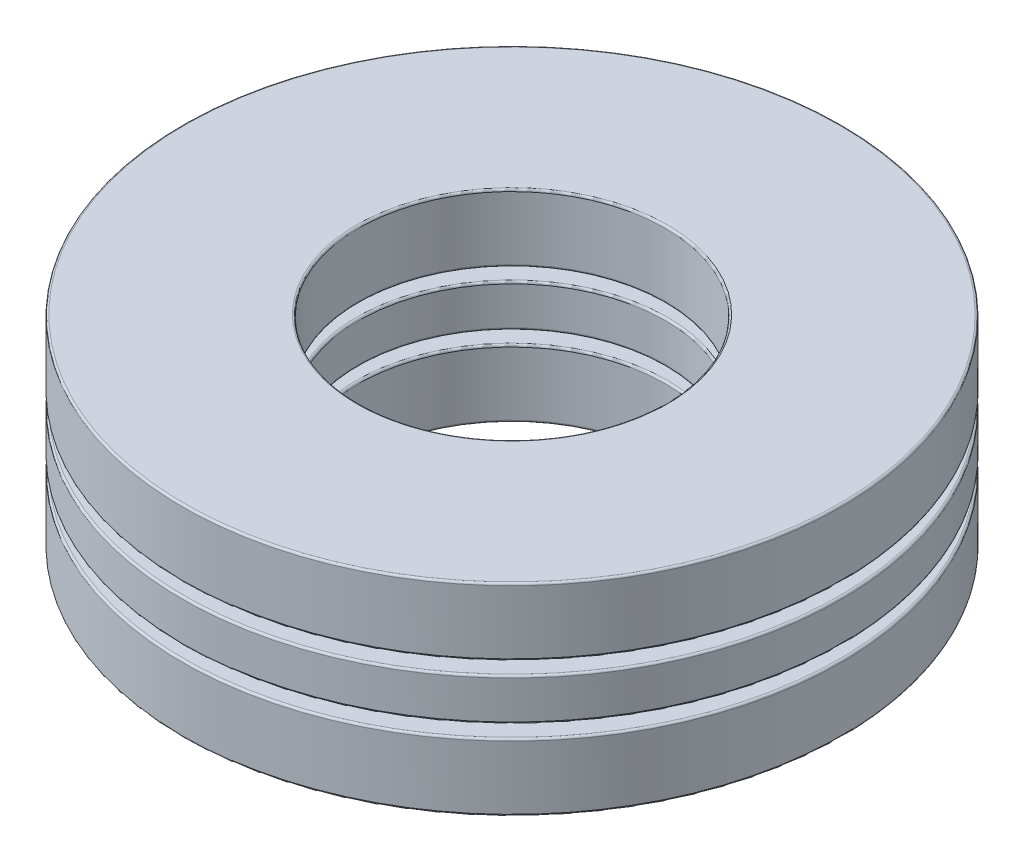
ISO-10303-21;
HEADER;
FILE_DESCRIPTION(('STEP AP214'),'2;1');
FILE_NAME('part.step','',(''),(''),'','','');
FILE_SCHEMA(('AUTOMOTIVE_DESIGN { 1 0 10303 214 1 1 1 1 }'));
ENDSEC;
DATA;
#1=APPLICATION_CONTEXT('core data for automotive mechanical design processes');
#2=APPLICATION_PROTOCOL_DEFINITION('international standard','automotive_design',2000,#1);
#3=PRODUCT_CONTEXT('',#1,'mechanical');
#4=PRODUCT('Part','Part','',(#3));
#5=PRODUCT_RELATED_PRODUCT_CATEGORY('part','',(#4));
#6=PRODUCT_DEFINITION_FORMATION('','',#4);
#7=PRODUCT_DEFINITION_CONTEXT('part definition',#1,'design');
#8=PRODUCT_DEFINITION('design','',#6,#7);
#9=PRODUCT_DEFINITION_SHAPE('','',#8);
#10=(LENGTH_UNIT() NAMED_UNIT(*) SI_UNIT(.MILLI.,.METRE.));
#11=(NAMED_UNIT(*) PLANE_ANGLE_UNIT() SI_UNIT($,.RADIAN.));
#12=(NAMED_UNIT(*) SI_UNIT($,.STERADIAN.) SOLID_ANGLE_UNIT());
#13=UNCERTAINTY_MEASURE_WITH_UNIT(LENGTH_MEASURE(1.E-05),#10,'distance_accuracy_value','');
#14=(GEOMETRIC_REPRESENTATION_CONTEXT(3) GLOBAL_UNCERTAINTY_ASSIGNED_CONTEXT((#13)) GLOBAL_UNIT_ASSIGNED_CONTEXT((#10,
#11,#12)) REPRESENTATION_CONTEXT('',''));
#15=CARTESIAN_POINT('',(0.,0.,0.));
#16=DIRECTION('',(0.,0.,1.));
#17=DIRECTION('',(1.,0.,0.));
#18=AXIS2_PLACEMENT_3D('',#15,#16,#17);
#19=CARTESIAN_POINT('',(0.,-3.1623,0.));
#20=DIRECTION('',(0.,-1.,0.));
#21=DIRECTION('',(0.,0.,-1.));
#22=AXIS2_PLACEMENT_3D('',#19,#20,#21);
#23=CYLINDRICAL_SURFACE('',#22,10.31875);
#24=CARTESIAN_POINT('',(0.,-3.099054,0.));
#25=DIRECTION('',(0.,1.,0.));
#26=DIRECTION('',(0.,0.,1.));
#27=AXIS2_PLACEMENT_3D('',#24,#25,#26);
#28=CIRCLE('',#27,10.31875);
#29=CARTESIAN_POINT('',(0.,-3.099054,10.31875));
#30=VERTEX_POINT('',#29);
#31=EDGE_CURVE('E11',#30,#30,#28,.T.);
#32=ORIENTED_EDGE('',*,*,#31,.T.);
#33=EDGE_LOOP('',(#32));
#34=FACE_BOUND('',#33,.T.);
#35=CARTESIAN_POINT('',(0.,-1.117346,0.));
#36=DIRECTION('',(0.,-1.,0.));
#37=DIRECTION('',(0.,0.,-1.));
#38=AXIS2_PLACEMENT_3D('',#35,#36,#37);
#39=CIRCLE('',#38,10.31875);
#40=CARTESIAN_POINT('',(0.,-1.117346,-10.31875));
#41=VERTEX_POINT('',#40);
#42=EDGE_CURVE('E51',#41,#41,#39,.T.);
#43=ORIENTED_EDGE('',*,*,#42,.T.);
#44=EDGE_LOOP('',(#43));
#45=FACE_BOUND('',#44,.T.);
#46=ADVANCED_FACE('F44',(#34,#45),#23,.T.);
#47=CARTESIAN_POINT('',(0.,-1.0541,10.31875));
#48=DIRECTION('',(0.,-1.,0.));
#49=DIRECTION('',(0.,0.,-1.));
#50=AXIS2_PLACEMENT_3D('',#47,#48,#49);
#51=PLANE('',#50);
#52=CARTESIAN_POINT('',(0.,-1.0541,0.));
#53=DIRECTION('',(0.,-1.,0.));
#54=DIRECTION('',(0.,0.,-1.));
#55=AXIS2_PLACEMENT_3D('',#52,#53,#54);
#56=CIRCLE('',#55,4.863846);
#57=CARTESIAN_POINT('',(0.,-1.0541,-4.863846));
#58=VERTEX_POINT('',#57);
#59=EDGE_CURVE('E55',#58,#58,#56,.T.);
#60=ORIENTED_EDGE('',*,*,#59,.T.);
#61=EDGE_LOOP('',(#60));
#62=FACE_BOUND('',#61,.T.);
#63=CARTESIAN_POINT('',(0.,-1.0541,0.));
#64=DIRECTION('',(0.,-1.,0.));
#65=DIRECTION('',(0.,0.,-1.));
#66=AXIS2_PLACEMENT_3D('',#63,#64,#65);
#67=CIRCLE('',#66,10.255504);
#68=CARTESIAN_POINT('',(0.,-1.0541,-10.255504));
#69=VERTEX_POINT('',#68);
#70=EDGE_CURVE('E59',#69,#69,#67,.F.);
#71=ORIENTED_EDGE('',*,*,#70,.T.);
#72=EDGE_LOOP('',(#71));
#73=FACE_BOUND('',#72,.T.);
#74=ADVANCED_FACE('F87',(#62,#73),#51,.F.);
#75=CARTESIAN_POINT('',(0.,-3.1623,0.));
#76=DIRECTION('',(0.,-1.,0.));
#77=DIRECTION('',(0.,0.,-1.));
#78=AXIS2_PLACEMENT_3D('',#75,#76,#77);
#79=CYLINDRICAL_SURFACE('',#78,4.8006);
#80=CARTESIAN_POINT('',(0.,-3.099054,0.));
#81=DIRECTION('',(0.,1.,0.));
#82=DIRECTION('',(0.,0.,1.));
#83=AXIS2_PLACEMENT_3D('',#80,#81,#82);
#84=CIRCLE('',#83,4.8006);
#85=CARTESIAN_POINT('',(0.,-3.099054,4.8006));
#86=VERTEX_POINT('',#85);
#87=EDGE_CURVE('E70',#86,#86,#84,.F.);
#88=ORIENTED_EDGE('',*,*,#87,.T.);
#89=EDGE_LOOP('',(#88));
#90=FACE_BOUND('',#89,.T.);
#91=CARTESIAN_POINT('',(0.,-1.117346,0.));
#92=DIRECTION('',(0.,-1.,0.));
#93=DIRECTION('',(0.,0.,-1.));
#94=AXIS2_PLACEMENT_3D('',#91,#92,#93);
#95=CIRCLE('',#94,4.8006);
#96=CARTESIAN_POINT('',(0.,-1.117346,-4.8006));
#97=VERTEX_POINT('',#96);
#98=EDGE_CURVE('E73',#97,#97,#95,.F.);
#99=ORIENTED_EDGE('',*,*,#98,.T.);
#100=EDGE_LOOP('',(#99));
#101=FACE_BOUND('',#100,.T.);
#102=ADVANCED_FACE('F77',(#90,#101),#79,.F.);
#103=CARTESIAN_POINT('',(0.,-3.1623,10.31875));
#104=DIRECTION('',(0.,1.,0.));
#105=DIRECTION('',(0.,0.,1.));
#106=AXIS2_PLACEMENT_3D('',#103,#104,#105);
#107=PLANE('',#106);
#108=CARTESIAN_POINT('',(0.,-3.1623,0.));
#109=DIRECTION('',(0.,1.,0.));
#110=DIRECTION('',(0.,0.,1.));
#111=AXIS2_PLACEMENT_3D('',#108,#109,#110);
#112=CIRCLE('',#111,4.863846);
#113=CARTESIAN_POINT('',(0.,-3.1623,4.863846));
#114=VERTEX_POINT('',#113);
#115=EDGE_CURVE('E64',#114,#114,#112,.T.);
#116=ORIENTED_EDGE('',*,*,#115,.T.);
#117=EDGE_LOOP('',(#116));
#118=FACE_BOUND('',#117,.T.);
#119=CARTESIAN_POINT('',(0.,-3.1623,0.));
#120=DIRECTION('',(0.,1.,0.));
#121=DIRECTION('',(0.,0.,1.));
#122=AXIS2_PLACEMENT_3D('',#119,#120,#121);
#123=CIRCLE('',#122,10.255504);
#124=CARTESIAN_POINT('',(0.,-3.1623,10.255504));
#125=VERTEX_POINT('',#124);
#126=EDGE_CURVE('E67',#125,#125,#123,.F.);
#127=ORIENTED_EDGE('',*,*,#126,.T.);
#128=EDGE_LOOP('',(#127));
#129=FACE_BOUND('',#128,.T.);
#130=ADVANCED_FACE('F106',(#118,#129),#107,.F.);
#131=CARTESIAN_POINT('',(0.,-3.099054,0.));
#132=DIRECTION('',(0.,1.,0.));
#133=DIRECTION('',(0.,0.,1.));
#134=AXIS2_PLACEMENT_3D('',#131,#132,#133);
#135=TOROIDAL_SURFACE('',#134,4.863846,0.063246);
#136=ORIENTED_EDGE('',*,*,#115,.F.);
#137=EDGE_LOOP('',(#136));
#138=FACE_BOUND('',#137,.T.);
#139=ORIENTED_EDGE('',*,*,#87,.F.);
#140=EDGE_LOOP('',(#139));
#141=FACE_BOUND('',#140,.T.);
#142=ADVANCED_FACE('F83',(#138,#141),#135,.T.);
#143=CARTESIAN_POINT('',(0.,-1.117346,0.));
#144=DIRECTION('',(0.,-1.,0.));
#145=DIRECTION('',(0.,0.,-1.));
#146=AXIS2_PLACEMENT_3D('',#143,#144,#145);
#147=TOROIDAL_SURFACE('',#146,4.863846,0.063246);
#148=ORIENTED_EDGE('',*,*,#98,.F.);
#149=EDGE_LOOP('',(#148));
#150=FACE_BOUND('',#149,.T.);
#151=ORIENTED_EDGE('',*,*,#59,.F.);
#152=EDGE_LOOP('',(#151));
#153=FACE_BOUND('',#152,.T.);
#154=ADVANCED_FACE('F79',(#150,#153),#147,.T.);
#155=CARTESIAN_POINT('',(0.,-3.099054,0.));
#156=DIRECTION('',(0.,1.,0.));
#157=DIRECTION('',(0.,0.,1.));
#158=AXIS2_PLACEMENT_3D('',#155,#156,#157);
#159=TOROIDAL_SURFACE('',#158,10.255504,0.063246);
#160=ORIENTED_EDGE('',*,*,#31,.F.);
#161=EDGE_LOOP('',(#160));
#162=FACE_BOUND('',#161,.T.);
#163=ORIENTED_EDGE('',*,*,#126,.F.);
#164=EDGE_LOOP('',(#163));
#165=FACE_BOUND('',#164,.T.);
#166=ADVANCED_FACE('F82',(#162,#165),#159,.T.);
#167=CARTESIAN_POINT('',(0.,-1.117346,0.));
#168=DIRECTION('',(0.,-1.,0.));
#169=DIRECTION('',(0.,0.,-1.));
#170=AXIS2_PLACEMENT_3D('',#167,#168,#169);
#171=TOROIDAL_SURFACE('',#170,10.255504,0.063246);
#172=ORIENTED_EDGE('',*,*,#70,.F.);
#173=EDGE_LOOP('',(#172));
#174=FACE_BOUND('',#173,.T.);
#175=ORIENTED_EDGE('',*,*,#42,.F.);
#176=EDGE_LOOP('',(#175));
#177=FACE_BOUND('',#176,.T.);
#178=ADVANCED_FACE('F46',(#174,#177),#171,.T.);
#179=CLOSED_SHELL('',(#46,#74,#102,#130,#142,#154,#166,#178));
#180=MANIFOLD_SOLID_BREP('B2',#179);
#181=CARTESIAN_POINT('',(0.,-3.1623,0.));
#182=DIRECTION('',(0.,-1.,0.));
#183=DIRECTION('',(0.,0.,-1.));
#184=AXIS2_PLACEMENT_3D('',#181,#182,#183);
#185=CYLINDRICAL_SURFACE('',#184,10.31875);
#186=CARTESIAN_POINT('',(0.,1.117346,0.));
#187=DIRECTION('',(0.,1.,0.));
#188=DIRECTION('',(0.,0.,1.));
#189=AXIS2_PLACEMENT_3D('',#186,#187,#188);
#190=CIRCLE('',#189,10.31875);
#191=CARTESIAN_POINT('',(0.,1.117346,10.31875));
#192=VERTEX_POINT('',#191);
#193=EDGE_CURVE('E43',#192,#192,#190,.T.);
#194=ORIENTED_EDGE('',*,*,#193,.T.);
#195=EDGE_LOOP('',(#194));
#196=FACE_BOUND('',#195,.T.);
#197=CARTESIAN_POINT('',(0.,3.099054,0.));
#198=DIRECTION('',(0.,-1.,0.));
#199=DIRECTION('',(0.,0.,-1.));
#200=AXIS2_PLACEMENT_3D('',#197,#198,#199);
#201=CIRCLE('',#200,10.31875);
#202=CARTESIAN_POINT('',(0.,3.099054,-10.31875));
#203=VERTEX_POINT('',#202);
#204=EDGE_CURVE('E181',#203,#203,#201,.T.);
#205=ORIENTED_EDGE('',*,*,#204,.T.);
#206=EDGE_LOOP('',(#205));
#207=FACE_BOUND('',#206,.T.);
#208=ADVANCED_FACE('F174',(#196,#207),#185,.T.);
#209=CARTESIAN_POINT('',(0.,3.1623,10.31875));
#210=DIRECTION('',(0.,-1.,0.));
#211=DIRECTION('',(0.,0.,-1.));
#212=AXIS2_PLACEMENT_3D('',#209,#210,#211);
#213=PLANE('',#212);
#214=CARTESIAN_POINT('',(0.,3.1623,0.));
#215=DIRECTION('',(0.,-1.,0.));
#216=DIRECTION('',(0.,0.,-1.));
#217=AXIS2_PLACEMENT_3D('',#214,#215,#216);
#218=CIRCLE('',#217,4.863846);
#219=CARTESIAN_POINT('',(0.,3.1623,-4.863846));
#220=VERTEX_POINT('',#219);
#221=EDGE_CURVE('E185',#220,#220,#218,.T.);
#222=ORIENTED_EDGE('',*,*,#221,.T.);
#223=EDGE_LOOP('',(#222));
#224=FACE_BOUND('',#223,.T.);
#225=CARTESIAN_POINT('',(0.,3.1623,0.));
#226=DIRECTION('',(0.,-1.,0.));
#227=DIRECTION('',(0.,0.,-1.));
#228=AXIS2_PLACEMENT_3D('',#225,#226,#227);
#229=CIRCLE('',#228,10.255504);
#230=CARTESIAN_POINT('',(0.,3.1623,-10.255504));
#231=VERTEX_POINT('',#230);
#232=EDGE_CURVE('E189',#231,#231,#229,.F.);
#233=ORIENTED_EDGE('',*,*,#232,.T.);
#234=EDGE_LOOP('',(#233));
#235=FACE_BOUND('',#234,.T.);
#236=ADVANCED_FACE('F217',(#224,#235),#213,.F.);
#237=CARTESIAN_POINT('',(0.,-3.1623,0.));
#238=DIRECTION('',(0.,-1.,0.));
#239=DIRECTION('',(0.,0.,-1.));
#240=AXIS2_PLACEMENT_3D('',#237,#238,#239);
#241=CYLINDRICAL_SURFACE('',#240,4.8006);
#242=CARTESIAN_POINT('',(0.,1.117346,0.));
#243=DIRECTION('',(0.,1.,0.));
#244=DIRECTION('',(0.,0.,1.));
#245=AXIS2_PLACEMENT_3D('',#242,#243,#244);
#246=CIRCLE('',#245,4.8006);
#247=CARTESIAN_POINT('',(0.,1.117346,4.8006));
#248=VERTEX_POINT('',#247);
#249=EDGE_CURVE('E200',#248,#248,#246,.F.);
#250=ORIENTED_EDGE('',*,*,#249,.T.);
#251=EDGE_LOOP('',(#250));
#252=FACE_BOUND('',#251,.T.);
#253=CARTESIAN_POINT('',(0.,3.099054,0.));
#254=DIRECTION('',(0.,-1.,0.));
#255=DIRECTION('',(0.,0.,-1.));
#256=AXIS2_PLACEMENT_3D('',#253,#254,#255);
#257=CIRCLE('',#256,4.8006);
#258=CARTESIAN_POINT('',(0.,3.099054,-4.8006));
#259=VERTEX_POINT('',#258);
#260=EDGE_CURVE('E203',#259,#259,#257,.F.);
#261=ORIENTED_EDGE('',*,*,#260,.T.);
#262=EDGE_LOOP('',(#261));
#263=FACE_BOUND('',#262,.T.);
#264=ADVANCED_FACE('F207',(#252,#263),#241,.F.);
#265=CARTESIAN_POINT('',(0.,1.0541,10.31875));
#266=DIRECTION('',(0.,1.,0.));
#267=DIRECTION('',(0.,0.,1.));
#268=AXIS2_PLACEMENT_3D('',#265,#266,#267);
#269=PLANE('',#268);
#270=CARTESIAN_POINT('',(0.,1.0541,0.));
#271=DIRECTION('',(0.,1.,0.));
#272=DIRECTION('',(0.,0.,1.));
#273=AXIS2_PLACEMENT_3D('',#270,#271,#272);
#274=CIRCLE('',#273,4.863846);
#275=CARTESIAN_POINT('',(0.,1.0541,4.863846));
#276=VERTEX_POINT('',#275);
#277=EDGE_CURVE('E194',#276,#276,#274,.T.);
#278=ORIENTED_EDGE('',*,*,#277,.T.);
#279=EDGE_LOOP('',(#278));
#280=FACE_BOUND('',#279,.T.);
#281=CARTESIAN_POINT('',(0.,1.0541,0.));
#282=DIRECTION('',(0.,1.,0.));
#283=DIRECTION('',(0.,0.,1.));
#284=AXIS2_PLACEMENT_3D('',#281,#282,#283);
#285=CIRCLE('',#284,10.255504);
#286=CARTESIAN_POINT('',(0.,1.0541,10.255504));
#287=VERTEX_POINT('',#286);
#288=EDGE_CURVE('E197',#287,#287,#285,.F.);
#289=ORIENTED_EDGE('',*,*,#288,.T.);
#290=EDGE_LOOP('',(#289));
#291=FACE_BOUND('',#290,.T.);
#292=ADVANCED_FACE('F236',(#280,#291),#269,.F.);
#293=CARTESIAN_POINT('',(0.,1.117346,0.));
#294=DIRECTION('',(0.,1.,0.));
#295=DIRECTION('',(0.,0.,1.));
#296=AXIS2_PLACEMENT_3D('',#293,#294,#295);
#297=TOROIDAL_SURFACE('',#296,4.863846,0.063246);
#298=ORIENTED_EDGE('',*,*,#277,.F.);
#299=EDGE_LOOP('',(#298));
#300=FACE_BOUND('',#299,.T.);
#301=ORIENTED_EDGE('',*,*,#249,.F.);
#302=EDGE_LOOP('',(#301));
#303=FACE_BOUND('',#302,.T.);
#304=ADVANCED_FACE('F213',(#300,#303),#297,.T.);
#305=CARTESIAN_POINT('',(0.,3.099054,0.));
#306=DIRECTION('',(0.,-1.,0.));
#307=DIRECTION('',(0.,0.,-1.));
#308=AXIS2_PLACEMENT_3D('',#305,#306,#307);
#309=TOROIDAL_SURFACE('',#308,4.863846,0.063246);
#310=ORIENTED_EDGE('',*,*,#260,.F.);
#311=EDGE_LOOP('',(#310));
#312=FACE_BOUND('',#311,.T.);
#313=ORIENTED_EDGE('',*,*,#221,.F.);
#314=EDGE_LOOP('',(#313));
#315=FACE_BOUND('',#314,.T.);
#316=ADVANCED_FACE('F209',(#312,#315),#309,.T.);
#317=CARTESIAN_POINT('',(0.,1.117346,0.));
#318=DIRECTION('',(0.,1.,0.));
#319=DIRECTION('',(0.,0.,1.));
#320=AXIS2_PLACEMENT_3D('',#317,#318,#319);
#321=TOROIDAL_SURFACE('',#320,10.255504,0.063246);
#322=ORIENTED_EDGE('',*,*,#193,.F.);
#323=EDGE_LOOP('',(#322));
#324=FACE_BOUND('',#323,.T.);
#325=ORIENTED_EDGE('',*,*,#288,.F.);
#326=EDGE_LOOP('',(#325));
#327=FACE_BOUND('',#326,.T.);
#328=ADVANCED_FACE('F212',(#324,#327),#321,.T.);
#329=CARTESIAN_POINT('',(0.,3.099054,0.));
#330=DIRECTION('',(0.,-1.,0.));
#331=DIRECTION('',(0.,0.,-1.));
#332=AXIS2_PLACEMENT_3D('',#329,#330,#331);
#333=TOROIDAL_SURFACE('',#332,10.255504,0.063246);
#334=ORIENTED_EDGE('',*,*,#232,.F.);
#335=EDGE_LOOP('',(#334));
#336=FACE_BOUND('',#335,.T.);
#337=ORIENTED_EDGE('',*,*,#204,.F.);
#338=EDGE_LOOP('',(#337));
#339=FACE_BOUND('',#338,.T.);
#340=ADVANCED_FACE('F176',(#336,#339),#333,.T.);
#341=CLOSED_SHELL('',(#208,#236,#264,#292,#304,#316,#328,#340));
#342=MANIFOLD_SOLID_BREP('B6',#341);
#343=CARTESIAN_POINT('',(-7.559675,0.,0.));
#344=DIRECTION('',(0.,1.,0.));
#345=DIRECTION('',(1.,0.,0.));
#346=AXIS2_PLACEMENT_3D('',#343,#344,#345);
#347=SPHERICAL_SURFACE('',#346,1.0541);
#348=CARTESIAN_POINT('',(-7.559675,1.0541,0.));
#349=VERTEX_POINT('',#348);
#350=VERTEX_LOOP('',#349);
#351=FACE_BOUND('',#350,.T.);
#352=ADVANCED_FACE('F304',(#351),#347,.T.);
#353=CLOSED_SHELL('',(#352));
#354=MANIFOLD_SOLID_BREP('B38',#353);
#355=CARTESIAN_POINT('',(0.,0.,-7.559675));
#356=DIRECTION('',(0.,1.,0.));
#357=DIRECTION('',(0.,0.,1.));
#358=AXIS2_PLACEMENT_3D('',#355,#356,#357);
#359=SPHERICAL_SURFACE('',#358,1.0541);
#360=CARTESIAN_POINT('',(0.,1.0541,-7.559675));
#361=VERTEX_POINT('',#360);
#362=VERTEX_LOOP('',#361);
#363=FACE_BOUND('',#362,.T.);
#364=ADVANCED_FACE('F325',(#363),#359,.T.);
#365=CLOSED_SHELL('',(#364));
#366=MANIFOLD_SOLID_BREP('B170',#365);
#367=CARTESIAN_POINT('',(7.559675,0.,0.));
#368=DIRECTION('',(0.,1.,0.));
#369=DIRECTION('',(-1.,0.,0.));
#370=AXIS2_PLACEMENT_3D('',#367,#368,#369);
#371=SPHERICAL_SURFACE('',#370,1.0541);
#372=CARTESIAN_POINT('',(7.559675,1.0541,0.));
#373=VERTEX_POINT('',#372);
#374=VERTEX_LOOP('',#373);
#375=FACE_BOUND('',#374,.T.);
#376=ADVANCED_FACE('F346',(#375),#371,.T.);
#377=CLOSED_SHELL('',(#376));
#378=MANIFOLD_SOLID_BREP('B300',#377);
#379=CARTESIAN_POINT('',(0.,0.,7.559675));
#380=DIRECTION('',(0.,1.,0.));
#381=DIRECTION('',(0.,0.,-1.));
#382=AXIS2_PLACEMENT_3D('',#379,#380,#381);
#383=SPHERICAL_SURFACE('',#382,1.0541);
#384=CARTESIAN_POINT('',(0.,1.0541,7.559675));
#385=VERTEX_POINT('',#384);
#386=VERTEX_LOOP('',#385);
#387=FACE_BOUND('',#386,.T.);
#388=ADVANCED_FACE('F368',(#387),#383,.T.);
#389=CLOSED_SHELL('',(#388));
#390=MANIFOLD_SOLID_BREP('B321',#389);
#391=CARTESIAN_POINT('',(0.,-3.1623,0.));
#392=DIRECTION('',(0.,-1.,0.));
#393=DIRECTION('',(0.,0.,-1.));
#394=AXIS2_PLACEMENT_3D('',#391,#392,#393);
#395=CYLINDRICAL_SURFACE('',#394,10.31875);
#396=CARTESIAN_POINT('',(0.,-0.595566500000002,0.));
#397=DIRECTION('',(0.,1.,0.));
#398=DIRECTION('',(0.,0.,1.));
#399=AXIS2_PLACEMENT_3D('',#396,#397,#398);
#400=CIRCLE('',#399,10.31875);
#401=CARTESIAN_POINT('',(0.,-0.595566500000002,10.31875));
#402=VERTEX_POINT('',#401);
#403=EDGE_CURVE('E367',#402,#402,#400,.T.);
#404=ORIENTED_EDGE('',*,*,#403,.T.);
#405=EDGE_LOOP('',(#404));
#406=FACE_BOUND('',#405,.T.);
#407=CARTESIAN_POINT('',(0.,0.595566499999999,0.));
#408=DIRECTION('',(0.,-1.,0.));
#409=DIRECTION('',(0.,0.,-1.));
#410=AXIS2_PLACEMENT_3D('',#407,#408,#409);
#411=CIRCLE('',#410,10.31875);
#412=CARTESIAN_POINT('',(0.,0.595566499999999,-10.31875));
#413=VERTEX_POINT('',#412);
#414=EDGE_CURVE('E390',#413,#413,#411,.T.);
#415=ORIENTED_EDGE('',*,*,#414,.T.);
#416=EDGE_LOOP('',(#415));
#417=FACE_BOUND('',#416,.T.);
#418=ADVANCED_FACE('F383',(#406,#417),#395,.T.);
#419=CARTESIAN_POINT('',(0.,-0.658812500000002,10.31875));
#420=DIRECTION('',(0.,1.,0.));
#421=DIRECTION('',(0.,0.,1.));
#422=AXIS2_PLACEMENT_3D('',#419,#420,#421);
#423=PLANE('',#422);
#424=CARTESIAN_POINT('',(0.,-0.658812500000002,0.));
#425=DIRECTION('',(0.,1.,0.));
#426=DIRECTION('',(0.,0.,1.));
#427=AXIS2_PLACEMENT_3D('',#424,#425,#426);
#428=CIRCLE('',#427,4.863846);
#429=CARTESIAN_POINT('',(0.,-0.658812500000002,4.863846));
#430=VERTEX_POINT('',#429);
#431=EDGE_CURVE('E403',#430,#430,#428,.T.);
#432=ORIENTED_EDGE('',*,*,#431,.T.);
#433=EDGE_LOOP('',(#432));
#434=FACE_BOUND('',#433,.T.);
#435=CARTESIAN_POINT('',(0.,-0.658812500000002,0.));
#436=DIRECTION('',(0.,1.,0.));
#437=DIRECTION('',(0.,0.,1.));
#438=AXIS2_PLACEMENT_3D('',#435,#436,#437);
#439=CIRCLE('',#438,10.255504);
#440=CARTESIAN_POINT('',(0.,-0.658812500000002,10.255504));
#441=VERTEX_POINT('',#440);
#442=EDGE_CURVE('E406',#441,#441,#439,.F.);
#443=ORIENTED_EDGE('',*,*,#442,.T.);
#444=EDGE_LOOP('',(#443));
#445=FACE_BOUND('',#444,.T.);
#446=CARTESIAN_POINT('',(-7.559675,-0.658812500000002,0.));
#447=DIRECTION('',(0.,1.,0.));
#448=DIRECTION('',(-1.,0.,0.));
#449=AXIS2_PLACEMENT_3D('',#446,#447,#448);
#450=CIRCLE('',#449,0.822856548763968);
#451=CARTESIAN_POINT('',(-6.73681845123603,-0.658812500000002,0.));
#452=VERTEX_POINT('',#451);
#453=EDGE_CURVE('E433',#452,#452,#450,.T.);
#454=ORIENTED_EDGE('',*,*,#453,.T.);
#455=EDGE_LOOP('',(#454));
#456=FACE_BOUND('',#455,.T.);
#457=CARTESIAN_POINT('',(0.,-0.658812500000002,-7.559675));
#458=DIRECTION('',(0.,1.,0.));
#459=DIRECTION('',(0.,0.,-1.));
#460=AXIS2_PLACEMENT_3D('',#457,#458,#459);
#461=CIRCLE('',#460,0.822856548763968);
#462=CARTESIAN_POINT('',(0.,-0.658812500000002,-6.73681845123603));
#463=VERTEX_POINT('',#462);
#464=EDGE_CURVE('E427',#463,#463,#461,.T.);
#465=ORIENTED_EDGE('',*,*,#464,.T.);
#466=EDGE_LOOP('',(#465));
#467=FACE_BOUND('',#466,.T.);
#468=CARTESIAN_POINT('',(7.559675,-0.658812500000002,0.));
#469=DIRECTION('',(0.,1.,0.));
#470=DIRECTION('',(1.,0.,0.));
#471=AXIS2_PLACEMENT_3D('',#468,#469,#470);
#472=CIRCLE('',#471,0.822856548763968);
#473=CARTESIAN_POINT('',(6.73681845123603,-0.658812500000002,0.));
#474=VERTEX_POINT('',#473);
#475=EDGE_CURVE('E419',#474,#474,#472,.T.);
#476=ORIENTED_EDGE('',*,*,#475,.T.);
#477=EDGE_LOOP('',(#476));
#478=FACE_BOUND('',#477,.T.);
#479=CARTESIAN_POINT('',(0.,-0.658812500000002,7.559675));
#480=DIRECTION('',(0.,1.,0.));
#481=DIRECTION('',(0.,0.,1.));
#482=AXIS2_PLACEMENT_3D('',#479,#480,#481);
#483=CIRCLE('',#482,0.822856548763968);
#484=CARTESIAN_POINT('',(0.,-0.658812500000002,6.73681845123603));
#485=VERTEX_POINT('',#484);
#486=EDGE_CURVE('E415',#485,#485,#483,.T.);
#487=ORIENTED_EDGE('',*,*,#486,.T.);
#488=EDGE_LOOP('',(#487));
#489=FACE_BOUND('',#488,.T.);
#490=ADVANCED_FACE('F451',(#434,#445,#456,#467,#478,#489),#423,.F.);
#491=CARTESIAN_POINT('',(0.,-3.1623,0.));
#492=DIRECTION('',(0.,-1.,0.));
#493=DIRECTION('',(0.,0.,-1.));
#494=AXIS2_PLACEMENT_3D('',#491,#492,#493);
#495=CYLINDRICAL_SURFACE('',#494,4.8006);
#496=CARTESIAN_POINT('',(0.,-0.595566500000002,0.));
#497=DIRECTION('',(0.,1.,0.));
#498=DIRECTION('',(0.,0.,1.));
#499=AXIS2_PLACEMENT_3D('',#496,#497,#498);
#500=CIRCLE('',#499,4.8006);
#501=CARTESIAN_POINT('',(0.,-0.595566500000002,4.8006));
#502=VERTEX_POINT('',#501);
#503=EDGE_CURVE('E409',#502,#502,#500,.F.);
#504=ORIENTED_EDGE('',*,*,#503,.T.);
#505=EDGE_LOOP('',(#504));
#506=FACE_BOUND('',#505,.T.);
#507=CARTESIAN_POINT('',(0.,0.595566499999999,0.));
#508=DIRECTION('',(0.,-1.,0.));
#509=DIRECTION('',(0.,0.,-1.));
#510=AXIS2_PLACEMENT_3D('',#507,#508,#509);
#511=CIRCLE('',#510,4.8006);
#512=CARTESIAN_POINT('',(0.,0.595566499999999,-4.8006));
#513=VERTEX_POINT('',#512);
#514=EDGE_CURVE('E412',#513,#513,#511,.F.);
#515=ORIENTED_EDGE('',*,*,#514,.T.);
#516=EDGE_LOOP('',(#515));
#517=FACE_BOUND('',#516,.T.);
#518=ADVANCED_FACE('F454',(#506,#517),#495,.F.);
#519=CARTESIAN_POINT('',(0.,0.658812499999998,10.31875));
#520=DIRECTION('',(0.,-1.,0.));
#521=DIRECTION('',(0.,0.,-1.));
#522=AXIS2_PLACEMENT_3D('',#519,#520,#521);
#523=PLANE('',#522);
#524=CARTESIAN_POINT('',(0.,0.658812499999998,0.));
#525=DIRECTION('',(0.,-1.,0.));
#526=DIRECTION('',(0.,0.,-1.));
#527=AXIS2_PLACEMENT_3D('',#524,#525,#526);
#528=CIRCLE('',#527,4.863846);
#529=CARTESIAN_POINT('',(0.,0.658812499999998,-4.863846));
#530=VERTEX_POINT('',#529);
#531=EDGE_CURVE('E394',#530,#530,#528,.T.);
#532=ORIENTED_EDGE('',*,*,#531,.T.);
#533=EDGE_LOOP('',(#532));
#534=FACE_BOUND('',#533,.T.);
#535=CARTESIAN_POINT('',(0.,0.658812499999998,0.));
#536=DIRECTION('',(0.,-1.,0.));
#537=DIRECTION('',(0.,0.,-1.));
#538=AXIS2_PLACEMENT_3D('',#535,#536,#537);
#539=CIRCLE('',#538,10.255504);
#540=CARTESIAN_POINT('',(0.,0.658812499999998,-10.255504));
#541=VERTEX_POINT('',#540);
#542=EDGE_CURVE('E398',#541,#541,#539,.F.);
#543=ORIENTED_EDGE('',*,*,#542,.T.);
#544=EDGE_LOOP('',(#543));
#545=FACE_BOUND('',#544,.T.);
#546=CARTESIAN_POINT('',(-7.559675,0.658812499999998,0.));
#547=DIRECTION('',(0.,-1.,0.));
#548=DIRECTION('',(1.,0.,0.));
#549=AXIS2_PLACEMENT_3D('',#546,#547,#548);
#550=CIRCLE('',#549,0.82285654876397);
#551=CARTESIAN_POINT('',(-6.73681845123603,0.658812499999998,0.));
#552=VERTEX_POINT('',#551);
#553=EDGE_CURVE('E436',#552,#552,#550,.T.);
#554=ORIENTED_EDGE('',*,*,#553,.T.);
#555=EDGE_LOOP('',(#554));
#556=FACE_BOUND('',#555,.T.);
#557=CARTESIAN_POINT('',(0.,0.658812499999998,-7.559675));
#558=DIRECTION('',(0.,-1.,0.));
#559=DIRECTION('',(0.,0.,1.));
#560=AXIS2_PLACEMENT_3D('',#557,#558,#559);
#561=CIRCLE('',#560,0.82285654876397);
#562=CARTESIAN_POINT('',(0.,0.658812499999998,-6.73681845123603));
#563=VERTEX_POINT('',#562);
#564=EDGE_CURVE('E430',#563,#563,#561,.T.);
#565=ORIENTED_EDGE('',*,*,#564,.T.);
#566=EDGE_LOOP('',(#565));
#567=FACE_BOUND('',#566,.T.);
#568=CARTESIAN_POINT('',(7.559675,0.658812499999998,0.));
#569=DIRECTION('',(0.,-1.,0.));
#570=DIRECTION('',(-1.,0.,0.));
#571=AXIS2_PLACEMENT_3D('',#568,#569,#570);
#572=CIRCLE('',#571,0.82285654876397);
#573=CARTESIAN_POINT('',(6.73681845123603,0.658812499999998,0.));
#574=VERTEX_POINT('',#573);
#575=EDGE_CURVE('E424',#574,#574,#572,.T.);
#576=ORIENTED_EDGE('',*,*,#575,.T.);
#577=EDGE_LOOP('',(#576));
#578=FACE_BOUND('',#577,.T.);
#579=CARTESIAN_POINT('',(0.,0.658812499999998,7.559675));
#580=DIRECTION('',(0.,-1.,0.));
#581=DIRECTION('',(0.,0.,-1.));
#582=AXIS2_PLACEMENT_3D('',#579,#580,#581);
#583=CIRCLE('',#582,0.82285654876397);
#584=CARTESIAN_POINT('',(0.,0.658812499999998,6.73681845123603));
#585=VERTEX_POINT('',#584);
#586=EDGE_CURVE('E416',#585,#585,#583,.T.);
#587=ORIENTED_EDGE('',*,*,#586,.T.);
#588=EDGE_LOOP('',(#587));
#589=FACE_BOUND('',#588,.T.);
#590=ADVANCED_FACE('F440',(#534,#545,#556,#567,#578,#589),#523,.F.);
#591=CARTESIAN_POINT('',(0.,0.,7.559675));
#592=DIRECTION('',(0.,1.,0.));
#593=DIRECTION('',(0.,0.,-1.));
#594=AXIS2_PLACEMENT_3D('',#591,#592,#593);
#595=SPHERICAL_SURFACE('',#594,1.0541);
#596=CARTESIAN_POINT('',(0.,0.658812499999998,6.73681845123603));
#597=CARTESIAN_POINT('',(0.,0.647238943443736,6.72755193403165));
#598=CARTESIAN_POINT('',(0.,0.635469652679911,6.71852991215499));
#599=CARTESIAN_POINT('',(0.,0.611561074081482,6.70099021208892));
#600=CARTESIAN_POINT('',(0.,0.599421786246878,6.69247253389952));
#601=CARTESIAN_POINT('',(0.,0.574794684851238,6.67595687423976));
#602=CARTESIAN_POINT('',(0.,0.562306871290202,6.66795889276941));
#603=CARTESIAN_POINT('',(0.,0.537004986727889,6.65249681383233));
#604=CARTESIAN_POINT('',(0.,0.524190915726612,6.64503271636559));
#605=CARTESIAN_POINT('',(0.,0.498259318087619,6.63065170675415));
#606=CARTESIAN_POINT('',(0.,0.485141791449903,6.62373479460944));
#607=CARTESIAN_POINT('',(0.,0.458626637229513,6.61046046558059));
#608=CARTESIAN_POINT('',(0.,0.445229009646839,6.60410304869644));
#609=CARTESIAN_POINT('',(0.,0.418177503472518,6.5919590287337));
#610=CARTESIAN_POINT('',(0.,0.40452362488087,6.58617242565512));
#611=CARTESIAN_POINT('',(0.,0.376983923716169,6.57518033443727));
#612=CARTESIAN_POINT('',(0.,0.363098101143116,6.56997484629801));
#613=CARTESIAN_POINT('',(0.,0.335119231709482,6.56015425191552));
#614=CARTESIAN_POINT('',(0.,0.321026184848901,6.55553914567228));
#615=CARTESIAN_POINT('',(0.,0.292657955503132,6.54690753094298));
#616=CARTESIAN_POINT('',(0.,0.278382773017944,6.54289102245692));
#617=CARTESIAN_POINT('',(0.,0.249675685308893,6.53546375349441));
#618=CARTESIAN_POINT('',(0.,0.23524378008503,6.53205299301798));
#619=CARTESIAN_POINT('',(0.,0.206248938789373,6.52584329195932));
#620=CARTESIAN_POINT('',(0.,0.19168600271758,6.52304435137709));
#621=CARTESIAN_POINT('',(0.,0.162455024878593,6.51806327282236));
#622=CARTESIAN_POINT('',(0.,0.147786983111399,6.51588113484985));
#623=CARTESIAN_POINT('',(0.,0.118371906145179,6.51213754618854));
#624=CARTESIAN_POINT('',(0.,0.103624870946153,6.51057609549974));
#625=CARTESIAN_POINT('',(0.,0.0740780600050173,6.50807666112334));
#626=CARTESIAN_POINT('',(0.,0.0592782842629073,6.50713867743574));
#627=CARTESIAN_POINT('',(0.,0.0296523390138641,6.50588784687407));
#628=CARTESIAN_POINT('',(0.,0.014826169506931,6.505575));
#629=CARTESIAN_POINT('',(0.,-0.0148261695069352,6.505575));
#630=CARTESIAN_POINT('',(0.,-0.0296523390138684,6.50588784687407));
#631=CARTESIAN_POINT('',(0.,-0.0592782842629115,6.50713867743574));
#632=CARTESIAN_POINT('',(0.,-0.0740780600050214,6.50807666112334));
#633=CARTESIAN_POINT('',(0.,-0.103624870946157,6.51057609549974));
#634=CARTESIAN_POINT('',(0.,-0.118371906145183,6.51213754618854));
#635=CARTESIAN_POINT('',(0.,-0.147786983111403,6.51588113484985));
#636=CARTESIAN_POINT('',(0.,-0.162455024878597,6.51806327282236));
#637=CARTESIAN_POINT('',(0.,-0.191686002717584,6.52304435137709));
#638=CARTESIAN_POINT('',(0.,-0.206248938789377,6.52584329195932));
#639=CARTESIAN_POINT('',(0.,-0.235243780085034,6.53205299301798));
#640=CARTESIAN_POINT('',(0.,-0.249675685308897,6.53546375349442));
#641=CARTESIAN_POINT('',(0.,-0.278382773017948,6.54289102245692));
#642=CARTESIAN_POINT('',(0.,-0.292657955503136,6.54690753094298));
#643=CARTESIAN_POINT('',(0.,-0.321026184848905,6.55553914567228));
#644=CARTESIAN_POINT('',(0.,-0.335119231709486,6.56015425191552));
#645=CARTESIAN_POINT('',(0.,-0.36309810114312,6.56997484629801));
#646=CARTESIAN_POINT('',(0.,-0.376983923716173,6.57518033443727));
#647=CARTESIAN_POINT('',(0.,-0.404523624880874,6.58617242565512));
#648=CARTESIAN_POINT('',(0.,-0.418177503472522,6.59195902873371));
#649=CARTESIAN_POINT('',(0.,-0.445229009646843,6.60410304869644));
#650=CARTESIAN_POINT('',(0.,-0.458626637229516,6.61046046558059));
#651=CARTESIAN_POINT('',(0.,-0.485141791449906,6.62373479460944));
#652=CARTESIAN_POINT('',(0.,-0.498259318087623,6.63065170675415));
#653=CARTESIAN_POINT('',(0.,-0.524190915726616,6.64503271636559));
#654=CARTESIAN_POINT('',(0.,-0.537004986727893,6.65249681383233));
#655=CARTESIAN_POINT('',(0.,-0.562306871290205,6.66795889276942));
#656=CARTESIAN_POINT('',(0.,-0.574794684851241,6.67595687423977));
#657=CARTESIAN_POINT('',(0.,-0.599421786246881,6.69247253389952));
#658=CARTESIAN_POINT('',(0.,-0.611561074081485,6.70099021208893));
#659=CARTESIAN_POINT('',(0.,-0.635469652679914,6.71852991215499));
#660=CARTESIAN_POINT('',(0.,-0.647238943443739,6.72755193403165));
#661=CARTESIAN_POINT('',(0.,-0.658812500000002,6.73681845123603));
#662=B_SPLINE_CURVE_WITH_KNOTS('',3,(#596,#597,#598,#599,#600,#601,#602,#603,#604,#605,#606,
#607,#608,#609,#610,#611,#612,#613,#614,#615,#616,#617,#618,#619,#620,#621,#622,#623,#624,#625,
#626,#627,#628,#629,#630,#631,#632,#633,#634,#635,#636,#637,#638,#639,#640,#641,#642,#643,#644,
#645,#646,#647,#648,#649,#650,#651,#652,#653,#654,#655,#656,#657,#658,#659,#660,#661),
.UNSPECIFIED.,.F.,.F.,(4,2,2,2,2,2,2,2,2,2,2,2,2,2,2,2,2,2,2,2,2,2,2,2,2,2,2,2,2,2,2,2,4),(0.,
0.0444752096675247,0.088950419335049,0.133425629002574,0.177900838670098,0.222376048337623,
0.266851258005147,0.311326467672672,0.355801677340197,0.400276887007721,0.444752096675246,
0.48922730634277,0.533702516010295,0.578177725677819,0.622652935345344,0.667128145012868,
0.711603354680393,0.756078564347918,0.800553774015442,0.845028983682967,0.889504193350491,
0.933979403018016,0.978454612685541,1.02292982235307,1.06740503202059,1.11188024168811,
1.15635545135564,1.20083066102316,1.24530587069069,1.28978108035821,1.33425629002574,
1.37873149969326,1.42320670936079),.UNSPECIFIED.);
#663=EDGE_CURVE('BSEAM463',#585,#485,#662,.T.);
#664=ORIENTED_EDGE('',*,*,#586,.F.);
#665=ORIENTED_EDGE('',*,*,#486,.F.);
#666=ORIENTED_EDGE('',*,*,#663,.T.);
#667=ORIENTED_EDGE('',*,*,#663,.F.);
#668=EDGE_LOOP('',(#664,#666,#665,#667));
#669=FACE_BOUND('',#668,.T.);
#670=ADVANCED_FACE('F463',(#669),#595,.F.);
#671=CARTESIAN_POINT('',(7.559675,0.,0.));
#672=DIRECTION('',(0.,1.,0.));
#673=DIRECTION('',(-1.,0.,0.));
#674=AXIS2_PLACEMENT_3D('',#671,#672,#673);
#675=SPHERICAL_SURFACE('',#674,1.0541);
#676=CARTESIAN_POINT('',(6.73681845123603,0.658812499999998,0.));
#677=CARTESIAN_POINT('',(6.72755193403165,0.647238943443736,0.));
#678=CARTESIAN_POINT('',(6.71852991215499,0.635469652679911,0.));
#679=CARTESIAN_POINT('',(6.70099021208892,0.611561074081482,0.));
#680=CARTESIAN_POINT('',(6.69247253389952,0.599421786246878,0.));
#681=CARTESIAN_POINT('',(6.67595687423976,0.574794684851238,0.));
#682=CARTESIAN_POINT('',(6.66795889276941,0.562306871290202,0.));
#683=CARTESIAN_POINT('',(6.65249681383233,0.537004986727889,0.));
#684=CARTESIAN_POINT('',(6.64503271636559,0.524190915726612,0.));
#685=CARTESIAN_POINT('',(6.63065170675415,0.498259318087619,0.));
#686=CARTESIAN_POINT('',(6.62373479460944,0.485141791449903,0.));
#687=CARTESIAN_POINT('',(6.61046046558059,0.458626637229513,0.));
#688=CARTESIAN_POINT('',(6.60410304869644,0.445229009646839,0.));
#689=CARTESIAN_POINT('',(6.5919590287337,0.418177503472518,0.));
#690=CARTESIAN_POINT('',(6.58617242565512,0.40452362488087,0.));
#691=CARTESIAN_POINT('',(6.57518033443727,0.376983923716169,0.));
#692=CARTESIAN_POINT('',(6.56997484629801,0.363098101143116,0.));
#693=CARTESIAN_POINT('',(6.56015425191552,0.335119231709482,0.));
#694=CARTESIAN_POINT('',(6.55553914567228,0.321026184848901,0.));
#695=CARTESIAN_POINT('',(6.54690753094298,0.292657955503132,0.));
#696=CARTESIAN_POINT('',(6.54289102245692,0.278382773017944,0.));
#697=CARTESIAN_POINT('',(6.53546375349441,0.249675685308893,0.));
#698=CARTESIAN_POINT('',(6.53205299301798,0.23524378008503,0.));
#699=CARTESIAN_POINT('',(6.52584329195932,0.206248938789373,0.));
#700=CARTESIAN_POINT('',(6.52304435137709,0.19168600271758,0.));
#701=CARTESIAN_POINT('',(6.51806327282236,0.162455024878593,0.));
#702=CARTESIAN_POINT('',(6.51588113484985,0.147786983111399,0.));
#703=CARTESIAN_POINT('',(6.51213754618854,0.118371906145179,0.));
#704=CARTESIAN_POINT('',(6.51057609549974,0.103624870946153,0.));
#705=CARTESIAN_POINT('',(6.50807666112334,0.0740780600050173,0.));
#706=CARTESIAN_POINT('',(6.50713867743574,0.0592782842629073,0.));
#707=CARTESIAN_POINT('',(6.50588784687407,0.0296523390138641,0.));
#708=CARTESIAN_POINT('',(6.505575,0.014826169506931,0.));
#709=CARTESIAN_POINT('',(6.505575,-0.0148261695069352,0.));
#710=CARTESIAN_POINT('',(6.50588784687407,-0.0296523390138684,0.));
#711=CARTESIAN_POINT('',(6.50713867743574,-0.0592782842629115,0.));
#712=CARTESIAN_POINT('',(6.50807666112334,-0.0740780600050214,0.));
#713=CARTESIAN_POINT('',(6.51057609549974,-0.103624870946157,0.));
#714=CARTESIAN_POINT('',(6.51213754618854,-0.118371906145183,0.));
#715=CARTESIAN_POINT('',(6.51588113484985,-0.147786983111403,0.));
#716=CARTESIAN_POINT('',(6.51806327282236,-0.162455024878597,0.));
#717=CARTESIAN_POINT('',(6.52304435137709,-0.191686002717584,0.));
#718=CARTESIAN_POINT('',(6.52584329195932,-0.206248938789377,0.));
#719=CARTESIAN_POINT('',(6.53205299301798,-0.235243780085034,0.));
#720=CARTESIAN_POINT('',(6.53546375349442,-0.249675685308897,0.));
#721=CARTESIAN_POINT('',(6.54289102245692,-0.278382773017948,0.));
#722=CARTESIAN_POINT('',(6.54690753094298,-0.292657955503136,0.));
#723=CARTESIAN_POINT('',(6.55553914567228,-0.321026184848905,0.));
#724=CARTESIAN_POINT('',(6.56015425191552,-0.335119231709486,0.));
#725=CARTESIAN_POINT('',(6.56997484629801,-0.36309810114312,0.));
#726=CARTESIAN_POINT('',(6.57518033443727,-0.376983923716173,0.));
#727=CARTESIAN_POINT('',(6.58617242565512,-0.404523624880874,0.));
#728=CARTESIAN_POINT('',(6.59195902873371,-0.418177503472522,0.));
#729=CARTESIAN_POINT('',(6.60410304869644,-0.445229009646843,0.));
#730=CARTESIAN_POINT('',(6.61046046558059,-0.458626637229516,0.));
#731=CARTESIAN_POINT('',(6.62373479460944,-0.485141791449906,0.));
#732=CARTESIAN_POINT('',(6.63065170675415,-0.498259318087623,0.));
#733=CARTESIAN_POINT('',(6.64503271636559,-0.524190915726616,0.));
#734=CARTESIAN_POINT('',(6.65249681383233,-0.537004986727893,0.));
#735=CARTESIAN_POINT('',(6.66795889276942,-0.562306871290205,0.));
#736=CARTESIAN_POINT('',(6.67595687423977,-0.574794684851241,0.));
#737=CARTESIAN_POINT('',(6.69247253389952,-0.599421786246881,0.));
#738=CARTESIAN_POINT('',(6.70099021208893,-0.611561074081485,0.));
#739=CARTESIAN_POINT('',(6.71852991215499,-0.635469652679914,0.));
#740=CARTESIAN_POINT('',(6.72755193403165,-0.647238943443739,0.));
#741=CARTESIAN_POINT('',(6.73681845123603,-0.658812500000002,0.));
#742=B_SPLINE_CURVE_WITH_KNOTS('',3,(#676,#677,#678,#679,#680,#681,#682,#683,#684,#685,#686,
#687,#688,#689,#690,#691,#692,#693,#694,#695,#696,#697,#698,#699,#700,#701,#702,#703,#704,#705,
#706,#707,#708,#709,#710,#711,#712,#713,#714,#715,#716,#717,#718,#719,#720,#721,#722,#723,#724,
#725,#726,#727,#728,#729,#730,#731,#732,#733,#734,#735,#736,#737,#738,#739,#740,#741),
.UNSPECIFIED.,.F.,.F.,(4,2,2,2,2,2,2,2,2,2,2,2,2,2,2,2,2,2,2,2,2,2,2,2,2,2,2,2,2,2,2,2,4),(0.,
0.0444752096675247,0.088950419335049,0.133425629002574,0.177900838670098,0.222376048337623,
0.266851258005147,0.311326467672672,0.355801677340197,0.400276887007721,0.444752096675246,
0.48922730634277,0.533702516010295,0.578177725677819,0.622652935345344,0.667128145012868,
0.711603354680393,0.756078564347918,0.800553774015442,0.845028983682967,0.889504193350491,
0.933979403018016,0.978454612685541,1.02292982235307,1.06740503202059,1.11188024168811,
1.15635545135564,1.20083066102316,1.24530587069069,1.28978108035821,1.33425629002574,
1.37873149969326,1.42320670936079),.UNSPECIFIED.);
#743=EDGE_CURVE('BSEAM465',#574,#474,#742,.T.);
#744=ORIENTED_EDGE('',*,*,#575,.F.);
#745=ORIENTED_EDGE('',*,*,#475,.F.);
#746=ORIENTED_EDGE('',*,*,#743,.T.);
#747=ORIENTED_EDGE('',*,*,#743,.F.);
#748=EDGE_LOOP('',(#744,#746,#745,#747));
#749=FACE_BOUND('',#748,.T.);
#750=ADVANCED_FACE('F465',(#749),#675,.F.);
#751=CARTESIAN_POINT('',(0.,0.,-7.559675));
#752=DIRECTION('',(0.,1.,0.));
#753=DIRECTION('',(0.,0.,1.));
#754=AXIS2_PLACEMENT_3D('',#751,#752,#753);
#755=SPHERICAL_SURFACE('',#754,1.0541);
#756=CARTESIAN_POINT('',(0.,0.658812499999998,-6.73681845123603));
#757=CARTESIAN_POINT('',(0.,0.647238943443736,-6.72755193403165));
#758=CARTESIAN_POINT('',(0.,0.635469652679911,-6.71852991215499));
#759=CARTESIAN_POINT('',(0.,0.611561074081482,-6.70099021208892));
#760=CARTESIAN_POINT('',(0.,0.599421786246878,-6.69247253389952));
#761=CARTESIAN_POINT('',(0.,0.574794684851238,-6.67595687423976));
#762=CARTESIAN_POINT('',(0.,0.562306871290202,-6.66795889276941));
#763=CARTESIAN_POINT('',(0.,0.537004986727889,-6.65249681383233));
#764=CARTESIAN_POINT('',(0.,0.524190915726612,-6.64503271636559));
#765=CARTESIAN_POINT('',(0.,0.498259318087619,-6.63065170675415));
#766=CARTESIAN_POINT('',(0.,0.485141791449903,-6.62373479460944));
#767=CARTESIAN_POINT('',(0.,0.458626637229513,-6.61046046558059));
#768=CARTESIAN_POINT('',(0.,0.445229009646839,-6.60410304869644));
#769=CARTESIAN_POINT('',(0.,0.418177503472518,-6.5919590287337));
#770=CARTESIAN_POINT('',(0.,0.40452362488087,-6.58617242565512));
#771=CARTESIAN_POINT('',(0.,0.376983923716169,-6.57518033443727));
#772=CARTESIAN_POINT('',(0.,0.363098101143116,-6.56997484629801));
#773=CARTESIAN_POINT('',(0.,0.335119231709482,-6.56015425191552));
#774=CARTESIAN_POINT('',(0.,0.321026184848901,-6.55553914567228));
#775=CARTESIAN_POINT('',(0.,0.292657955503132,-6.54690753094298));
#776=CARTESIAN_POINT('',(0.,0.278382773017944,-6.54289102245692));
#777=CARTESIAN_POINT('',(0.,0.249675685308893,-6.53546375349441));
#778=CARTESIAN_POINT('',(0.,0.23524378008503,-6.53205299301798));
#779=CARTESIAN_POINT('',(0.,0.206248938789373,-6.52584329195932));
#780=CARTESIAN_POINT('',(0.,0.19168600271758,-6.52304435137709));
#781=CARTESIAN_POINT('',(0.,0.162455024878593,-6.51806327282236));
#782=CARTESIAN_POINT('',(0.,0.147786983111399,-6.51588113484985));
#783=CARTESIAN_POINT('',(0.,0.118371906145179,-6.51213754618854));
#784=CARTESIAN_POINT('',(0.,0.103624870946153,-6.51057609549974));
#785=CARTESIAN_POINT('',(0.,0.0740780600050173,-6.50807666112334));
#786=CARTESIAN_POINT('',(0.,0.0592782842629073,-6.50713867743574));
#787=CARTESIAN_POINT('',(0.,0.0296523390138641,-6.50588784687407));
#788=CARTESIAN_POINT('',(0.,0.014826169506931,-6.505575));
#789=CARTESIAN_POINT('',(0.,-0.0148261695069352,-6.505575));
#790=CARTESIAN_POINT('',(0.,-0.0296523390138684,-6.50588784687407));
#791=CARTESIAN_POINT('',(0.,-0.0592782842629115,-6.50713867743574));
#792=CARTESIAN_POINT('',(0.,-0.0740780600050214,-6.50807666112334));
#793=CARTESIAN_POINT('',(0.,-0.103624870946157,-6.51057609549974));
#794=CARTESIAN_POINT('',(0.,-0.118371906145183,-6.51213754618854));
#795=CARTESIAN_POINT('',(0.,-0.147786983111403,-6.51588113484985));
#796=CARTESIAN_POINT('',(0.,-0.162455024878597,-6.51806327282236));
#797=CARTESIAN_POINT('',(0.,-0.191686002717584,-6.52304435137709));
#798=CARTESIAN_POINT('',(0.,-0.206248938789377,-6.52584329195932));
#799=CARTESIAN_POINT('',(0.,-0.235243780085034,-6.53205299301798));
#800=CARTESIAN_POINT('',(0.,-0.249675685308897,-6.53546375349442));
#801=CARTESIAN_POINT('',(0.,-0.278382773017948,-6.54289102245692));
#802=CARTESIAN_POINT('',(0.,-0.292657955503136,-6.54690753094298));
#803=CARTESIAN_POINT('',(0.,-0.321026184848905,-6.55553914567228));
#804=CARTESIAN_POINT('',(0.,-0.335119231709486,-6.56015425191552));
#805=CARTESIAN_POINT('',(0.,-0.36309810114312,-6.56997484629801));
#806=CARTESIAN_POINT('',(0.,-0.376983923716173,-6.57518033443727));
#807=CARTESIAN_POINT('',(0.,-0.404523624880874,-6.58617242565512));
#808=CARTESIAN_POINT('',(0.,-0.418177503472522,-6.59195902873371));
#809=CARTESIAN_POINT('',(0.,-0.445229009646843,-6.60410304869644));
#810=CARTESIAN_POINT('',(0.,-0.458626637229516,-6.61046046558059));
#811=CARTESIAN_POINT('',(0.,-0.485141791449906,-6.62373479460944));
#812=CARTESIAN_POINT('',(0.,-0.498259318087623,-6.63065170675415));
#813=CARTESIAN_POINT('',(0.,-0.524190915726616,-6.64503271636559));
#814=CARTESIAN_POINT('',(0.,-0.537004986727893,-6.65249681383233));
#815=CARTESIAN_POINT('',(0.,-0.562306871290205,-6.66795889276942));
#816=CARTESIAN_POINT('',(0.,-0.574794684851241,-6.67595687423977));
#817=CARTESIAN_POINT('',(0.,-0.599421786246881,-6.69247253389952));
#818=CARTESIAN_POINT('',(0.,-0.611561074081485,-6.70099021208893));
#819=CARTESIAN_POINT('',(0.,-0.635469652679914,-6.71852991215499));
#820=CARTESIAN_POINT('',(0.,-0.647238943443739,-6.72755193403165));
#821=CARTESIAN_POINT('',(0.,-0.658812500000002,-6.73681845123603));
#822=B_SPLINE_CURVE_WITH_KNOTS('',3,(#756,#757,#758,#759,#760,#761,#762,#763,#764,#765,#766,
#767,#768,#769,#770,#771,#772,#773,#774,#775,#776,#777,#778,#779,#780,#781,#782,#783,#784,#785,
#786,#787,#788,#789,#790,#791,#792,#793,#794,#795,#796,#797,#798,#799,#800,#801,#802,#803,#804,
#805,#806,#807,#808,#809,#810,#811,#812,#813,#814,#815,#816,#817,#818,#819,#820,#821),
.UNSPECIFIED.,.F.,.F.,(4,2,2,2,2,2,2,2,2,2,2,2,2,2,2,2,2,2,2,2,2,2,2,2,2,2,2,2,2,2,2,2,4),(0.,
0.0444752096675247,0.088950419335049,0.133425629002574,0.177900838670098,0.222376048337623,
0.266851258005147,0.311326467672672,0.355801677340197,0.400276887007721,0.444752096675246,
0.48922730634277,0.533702516010295,0.578177725677819,0.622652935345344,0.667128145012868,
0.711603354680393,0.756078564347918,0.800553774015442,0.845028983682967,0.889504193350491,
0.933979403018016,0.978454612685541,1.02292982235307,1.06740503202059,1.11188024168811,
1.15635545135564,1.20083066102316,1.24530587069069,1.28978108035821,1.33425629002574,
1.37873149969326,1.42320670936079),.UNSPECIFIED.);
#823=EDGE_CURVE('BSEAM447',#563,#463,#822,.T.);
#824=ORIENTED_EDGE('',*,*,#564,.F.);
#825=ORIENTED_EDGE('',*,*,#464,.F.);
#826=ORIENTED_EDGE('',*,*,#823,.T.);
#827=ORIENTED_EDGE('',*,*,#823,.F.);
#828=EDGE_LOOP('',(#824,#826,#825,#827));
#829=FACE_BOUND('',#828,.T.);
#830=ADVANCED_FACE('F447',(#829),#755,.F.);
#831=CARTESIAN_POINT('',(-7.559675,0.,0.));
#832=DIRECTION('',(0.,1.,0.));
#833=DIRECTION('',(1.,0.,0.));
#834=AXIS2_PLACEMENT_3D('',#831,#832,#833);
#835=SPHERICAL_SURFACE('',#834,1.0541);
#836=CARTESIAN_POINT('',(-6.73681845123603,0.658812499999998,0.));
#837=CARTESIAN_POINT('',(-6.72755193403165,0.647238943443736,0.));
#838=CARTESIAN_POINT('',(-6.71852991215499,0.635469652679911,0.));
#839=CARTESIAN_POINT('',(-6.70099021208892,0.611561074081482,0.));
#840=CARTESIAN_POINT('',(-6.69247253389952,0.599421786246878,0.));
#841=CARTESIAN_POINT('',(-6.67595687423976,0.574794684851238,0.));
#842=CARTESIAN_POINT('',(-6.66795889276941,0.562306871290202,0.));
#843=CARTESIAN_POINT('',(-6.65249681383233,0.537004986727889,0.));
#844=CARTESIAN_POINT('',(-6.64503271636559,0.524190915726612,0.));
#845=CARTESIAN_POINT('',(-6.63065170675415,0.498259318087619,0.));
#846=CARTESIAN_POINT('',(-6.62373479460944,0.485141791449903,0.));
#847=CARTESIAN_POINT('',(-6.61046046558059,0.458626637229513,0.));
#848=CARTESIAN_POINT('',(-6.60410304869644,0.445229009646839,0.));
#849=CARTESIAN_POINT('',(-6.5919590287337,0.418177503472518,0.));
#850=CARTESIAN_POINT('',(-6.58617242565512,0.40452362488087,0.));
#851=CARTESIAN_POINT('',(-6.57518033443727,0.376983923716169,0.));
#852=CARTESIAN_POINT('',(-6.56997484629801,0.363098101143116,0.));
#853=CARTESIAN_POINT('',(-6.56015425191552,0.335119231709482,0.));
#854=CARTESIAN_POINT('',(-6.55553914567228,0.321026184848901,0.));
#855=CARTESIAN_POINT('',(-6.54690753094298,0.292657955503132,0.));
#856=CARTESIAN_POINT('',(-6.54289102245692,0.278382773017944,0.));
#857=CARTESIAN_POINT('',(-6.53546375349441,0.249675685308893,0.));
#858=CARTESIAN_POINT('',(-6.53205299301798,0.23524378008503,0.));
#859=CARTESIAN_POINT('',(-6.52584329195932,0.206248938789373,0.));
#860=CARTESIAN_POINT('',(-6.52304435137709,0.19168600271758,0.));
#861=CARTESIAN_POINT('',(-6.51806327282236,0.162455024878593,0.));
#862=CARTESIAN_POINT('',(-6.51588113484985,0.147786983111399,0.));
#863=CARTESIAN_POINT('',(-6.51213754618854,0.118371906145179,0.));
#864=CARTESIAN_POINT('',(-6.51057609549974,0.103624870946153,0.));
#865=CARTESIAN_POINT('',(-6.50807666112334,0.0740780600050173,0.));
#866=CARTESIAN_POINT('',(-6.50713867743574,0.0592782842629073,0.));
#867=CARTESIAN_POINT('',(-6.50588784687407,0.0296523390138641,0.));
#868=CARTESIAN_POINT('',(-6.505575,0.014826169506931,0.));
#869=CARTESIAN_POINT('',(-6.505575,-0.0148261695069352,0.));
#870=CARTESIAN_POINT('',(-6.50588784687407,-0.0296523390138684,0.));
#871=CARTESIAN_POINT('',(-6.50713867743574,-0.0592782842629115,0.));
#872=CARTESIAN_POINT('',(-6.50807666112334,-0.0740780600050214,0.));
#873=CARTESIAN_POINT('',(-6.51057609549974,-0.103624870946157,0.));
#874=CARTESIAN_POINT('',(-6.51213754618854,-0.118371906145183,0.));
#875=CARTESIAN_POINT('',(-6.51588113484985,-0.147786983111403,0.));
#876=CARTESIAN_POINT('',(-6.51806327282236,-0.162455024878597,0.));
#877=CARTESIAN_POINT('',(-6.52304435137709,-0.191686002717584,0.));
#878=CARTESIAN_POINT('',(-6.52584329195932,-0.206248938789377,0.));
#879=CARTESIAN_POINT('',(-6.53205299301798,-0.235243780085034,0.));
#880=CARTESIAN_POINT('',(-6.53546375349442,-0.249675685308897,0.));
#881=CARTESIAN_POINT('',(-6.54289102245692,-0.278382773017948,0.));
#882=CARTESIAN_POINT('',(-6.54690753094298,-0.292657955503136,0.));
#883=CARTESIAN_POINT('',(-6.55553914567228,-0.321026184848905,0.));
#884=CARTESIAN_POINT('',(-6.56015425191552,-0.335119231709486,0.));
#885=CARTESIAN_POINT('',(-6.56997484629801,-0.36309810114312,0.));
#886=CARTESIAN_POINT('',(-6.57518033443727,-0.376983923716173,0.));
#887=CARTESIAN_POINT('',(-6.58617242565512,-0.404523624880874,0.));
#888=CARTESIAN_POINT('',(-6.59195902873371,-0.418177503472522,0.));
#889=CARTESIAN_POINT('',(-6.60410304869644,-0.445229009646843,0.));
#890=CARTESIAN_POINT('',(-6.61046046558059,-0.458626637229516,0.));
#891=CARTESIAN_POINT('',(-6.62373479460944,-0.485141791449906,0.));
#892=CARTESIAN_POINT('',(-6.63065170675415,-0.498259318087623,0.));
#893=CARTESIAN_POINT('',(-6.64503271636559,-0.524190915726616,0.));
#894=CARTESIAN_POINT('',(-6.65249681383233,-0.537004986727893,0.));
#895=CARTESIAN_POINT('',(-6.66795889276942,-0.562306871290205,0.));
#896=CARTESIAN_POINT('',(-6.67595687423977,-0.574794684851241,0.));
#897=CARTESIAN_POINT('',(-6.69247253389952,-0.599421786246881,0.));
#898=CARTESIAN_POINT('',(-6.70099021208893,-0.611561074081485,0.));
#899=CARTESIAN_POINT('',(-6.71852991215499,-0.635469652679914,0.));
#900=CARTESIAN_POINT('',(-6.72755193403165,-0.647238943443739,0.));
#901=CARTESIAN_POINT('',(-6.73681845123603,-0.658812500000002,0.));
#902=B_SPLINE_CURVE_WITH_KNOTS('',3,(#836,#837,#838,#839,#840,#841,#842,#843,#844,#845,#846,
#847,#848,#849,#850,#851,#852,#853,#854,#855,#856,#857,#858,#859,#860,#861,#862,#863,#864,#865,
#866,#867,#868,#869,#870,#871,#872,#873,#874,#875,#876,#877,#878,#879,#880,#881,#882,#883,#884,
#885,#886,#887,#888,#889,#890,#891,#892,#893,#894,#895,#896,#897,#898,#899,#900,#901),
.UNSPECIFIED.,.F.,.F.,(4,2,2,2,2,2,2,2,2,2,2,2,2,2,2,2,2,2,2,2,2,2,2,2,2,2,2,2,2,2,2,2,4),(0.,
0.0444752096675247,0.088950419335049,0.133425629002574,0.177900838670098,0.222376048337623,
0.266851258005147,0.311326467672672,0.355801677340197,0.400276887007721,0.444752096675246,
0.48922730634277,0.533702516010295,0.578177725677819,0.622652935345344,0.667128145012868,
0.711603354680393,0.756078564347918,0.800553774015442,0.845028983682967,0.889504193350491,
0.933979403018016,0.978454612685541,1.02292982235307,1.06740503202059,1.11188024168811,
1.15635545135564,1.20083066102316,1.24530587069069,1.28978108035821,1.33425629002574,
1.37873149969326,1.42320670936079),.UNSPECIFIED.);
#903=EDGE_CURVE('BSEAM443',#552,#452,#902,.T.);
#904=ORIENTED_EDGE('',*,*,#553,.F.);
#905=ORIENTED_EDGE('',*,*,#453,.F.);
#906=ORIENTED_EDGE('',*,*,#903,.T.);
#907=ORIENTED_EDGE('',*,*,#903,.F.);
#908=EDGE_LOOP('',(#904,#906,#905,#907));
#909=FACE_BOUND('',#908,.T.);
#910=ADVANCED_FACE('F443',(#909),#835,.F.);
#911=CARTESIAN_POINT('',(0.,-0.595566500000002,0.));
#912=DIRECTION('',(0.,1.,0.));
#913=DIRECTION('',(0.,0.,1.));
#914=AXIS2_PLACEMENT_3D('',#911,#912,#913);
#915=TOROIDAL_SURFACE('',#914,4.863846,0.063246);
#916=ORIENTED_EDGE('',*,*,#431,.F.);
#917=EDGE_LOOP('',(#916));
#918=FACE_BOUND('',#917,.T.);
#919=ORIENTED_EDGE('',*,*,#503,.F.);
#920=EDGE_LOOP('',(#919));
#921=FACE_BOUND('',#920,.T.);
#922=ADVANCED_FACE('F446',(#918,#921),#915,.T.);
#923=CARTESIAN_POINT('',(0.,0.595566499999999,0.));
#924=DIRECTION('',(0.,-1.,0.));
#925=DIRECTION('',(0.,0.,-1.));
#926=AXIS2_PLACEMENT_3D('',#923,#924,#925);
#927=TOROIDAL_SURFACE('',#926,4.863846,0.063246);
#928=ORIENTED_EDGE('',*,*,#514,.F.);
#929=EDGE_LOOP('',(#928));
#930=FACE_BOUND('',#929,.T.);
#931=ORIENTED_EDGE('',*,*,#531,.F.);
#932=EDGE_LOOP('',(#931));
#933=FACE_BOUND('',#932,.T.);
#934=ADVANCED_FACE('F485',(#930,#933),#927,.T.);
#935=CARTESIAN_POINT('',(0.,-0.595566500000002,0.));
#936=DIRECTION('',(0.,1.,0.));
#937=DIRECTION('',(0.,0.,1.));
#938=AXIS2_PLACEMENT_3D('',#935,#936,#937);
#939=TOROIDAL_SURFACE('',#938,10.255504,0.063246);
#940=ORIENTED_EDGE('',*,*,#403,.F.);
#941=EDGE_LOOP('',(#940));
#942=FACE_BOUND('',#941,.T.);
#943=ORIENTED_EDGE('',*,*,#442,.F.);
#944=EDGE_LOOP('',(#943));
#945=FACE_BOUND('',#944,.T.);
#946=ADVANCED_FACE('F488',(#942,#945),#939,.T.);
#947=CARTESIAN_POINT('',(0.,0.595566499999999,0.));
#948=DIRECTION('',(0.,-1.,0.));
#949=DIRECTION('',(0.,0.,-1.));
#950=AXIS2_PLACEMENT_3D('',#947,#948,#949);
#951=TOROIDAL_SURFACE('',#950,10.255504,0.063246);
#952=ORIENTED_EDGE('',*,*,#542,.F.);
#953=EDGE_LOOP('',(#952));
#954=FACE_BOUND('',#953,.T.);
#955=ORIENTED_EDGE('',*,*,#414,.F.);
#956=EDGE_LOOP('',(#955));
#957=FACE_BOUND('',#956,.T.);
#958=ADVANCED_FACE('F385',(#954,#957),#951,.T.);
#959=CLOSED_SHELL('',(#418,#490,#518,#590,#670,#750,#830,#910,#922,#934,#946,#958));
#960=MANIFOLD_SOLID_BREP('B342',#959);
#961=ADVANCED_BREP_SHAPE_REPRESENTATION('',(#18,#180,#342,#354,#366,#378,#390,#960),#14);
#962=SHAPE_DEFINITION_REPRESENTATION(#9,#961);
ENDSEC;
END-ISO-10303-21;
